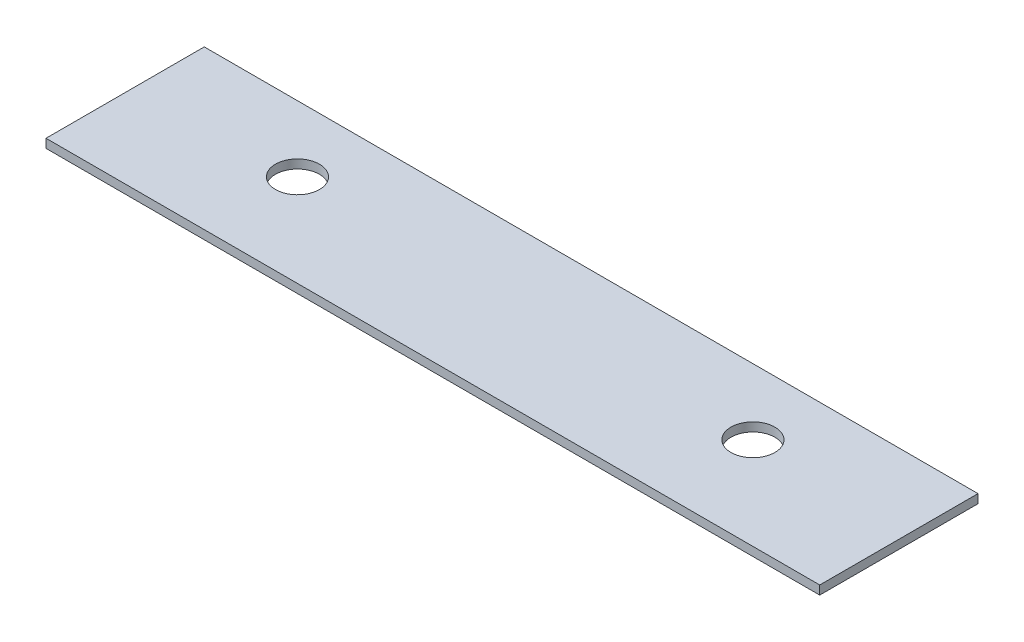
ISO-10303-21;
HEADER;
FILE_DESCRIPTION(('STEP AP214'),'2;1');
FILE_NAME('part.step','',(''),(''),'','','');
FILE_SCHEMA(('AUTOMOTIVE_DESIGN { 1 0 10303 214 1 1 1 1 }'));
ENDSEC;
DATA;
#1=APPLICATION_CONTEXT('core data for automotive mechanical design processes');
#2=APPLICATION_PROTOCOL_DEFINITION('international standard','automotive_design',2000,#1);
#3=PRODUCT_CONTEXT('',#1,'mechanical');
#4=PRODUCT('Part','Part','',(#3));
#5=PRODUCT_RELATED_PRODUCT_CATEGORY('part','',(#4));
#6=PRODUCT_DEFINITION_FORMATION('','',#4);
#7=PRODUCT_DEFINITION_CONTEXT('part definition',#1,'design');
#8=PRODUCT_DEFINITION('design','',#6,#7);
#9=PRODUCT_DEFINITION_SHAPE('','',#8);
#10=(LENGTH_UNIT() NAMED_UNIT(*) SI_UNIT(.MILLI.,.METRE.));
#11=(NAMED_UNIT(*) PLANE_ANGLE_UNIT() SI_UNIT($,.RADIAN.));
#12=(NAMED_UNIT(*) SI_UNIT($,.STERADIAN.) SOLID_ANGLE_UNIT());
#13=UNCERTAINTY_MEASURE_WITH_UNIT(LENGTH_MEASURE(1.E-05),#10,'distance_accuracy_value','');
#14=(GEOMETRIC_REPRESENTATION_CONTEXT(3) GLOBAL_UNCERTAINTY_ASSIGNED_CONTEXT((#13)) GLOBAL_UNIT_ASSIGNED_CONTEXT((#10,
#11,#12)) REPRESENTATION_CONTEXT('',''));
#15=CARTESIAN_POINT('',(0.,0.,0.));
#16=DIRECTION('',(0.,0.,1.));
#17=DIRECTION('',(1.,0.,0.));
#18=AXIS2_PLACEMENT_3D('',#15,#16,#17);
#19=CARTESIAN_POINT('',(0.0164218420878547,1.,1.69999250897351));
#20=DIRECTION('',(1.,0.,0.));
#21=DIRECTION('',(0.,0.,-1.));
#22=AXIS2_PLACEMENT_3D('',#19,#20,#21);
#23=PLANE('',#22);
#24=DIRECTION('',(0.,0.,1.));
#25=VECTOR('',#24,1.);
#26=CARTESIAN_POINT('',(0.0164218420878547,0.,1.69999250897351));
#27=LINE('',#26,#25);
#28=CARTESIAN_POINT('',(0.0164218420878547,0.,-16.3000074910265));
#29=VERTEX_POINT('',#28);
#30=CARTESIAN_POINT('',(0.0164218420878547,0.,1.69999250897351));
#31=VERTEX_POINT('',#30);
#32=EDGE_CURVE('E105',#29,#31,#27,.T.);
#33=ORIENTED_EDGE('',*,*,#32,.T.);
#34=DIRECTION('',(0.,-1.,0.));
#35=VECTOR('',#34,1.);
#36=CARTESIAN_POINT('',(0.0164218420878547,1.,1.69999250897351));
#37=LINE('',#36,#35);
#38=CARTESIAN_POINT('',(0.0164218420878547,1.,1.69999250897351));
#39=VERTEX_POINT('',#38);
#40=EDGE_CURVE('E11',#39,#31,#37,.T.);
#41=ORIENTED_EDGE('',*,*,#40,.F.);
#42=DIRECTION('',(0.,0.,1.));
#43=VECTOR('',#42,1.);
#44=CARTESIAN_POINT('',(0.0164218420878547,1.,1.69999250897351));
#45=LINE('',#44,#43);
#46=CARTESIAN_POINT('',(0.0164218420878547,1.,-16.3000074910265));
#47=VERTEX_POINT('',#46);
#48=EDGE_CURVE('E92',#47,#39,#45,.T.);
#49=ORIENTED_EDGE('',*,*,#48,.F.);
#50=DIRECTION('',(0.,-1.,0.));
#51=VECTOR('',#50,1.);
#52=CARTESIAN_POINT('',(0.0164218420878547,1.,-16.3000074910265));
#53=LINE('',#52,#51);
#54=EDGE_CURVE('E101',#47,#29,#53,.T.);
#55=ORIENTED_EDGE('',*,*,#54,.T.);
#56=EDGE_LOOP('',(#33,#41,#49,#55));
#57=FACE_BOUND('',#56,.T.);
#58=ADVANCED_FACE('F39',(#57),#23,.F.);
#59=CARTESIAN_POINT('',(0.0164218420878547,1.,1.69999250897351));
#60=DIRECTION('',(0.,0.,-1.));
#61=DIRECTION('',(-1.,0.,0.));
#62=AXIS2_PLACEMENT_3D('',#59,#60,#61);
#63=PLANE('',#62);
#64=DIRECTION('',(1.,0.,0.));
#65=VECTOR('',#64,1.);
#66=CARTESIAN_POINT('',(0.0164218420878547,0.,1.69999250897351));
#67=LINE('',#66,#65);
#68=CARTESIAN_POINT('',(88.0164218420879,0.,1.69999250897351));
#69=VERTEX_POINT('',#68);
#70=EDGE_CURVE('E96',#31,#69,#67,.T.);
#71=ORIENTED_EDGE('',*,*,#70,.T.);
#72=DIRECTION('',(0.,-1.,0.));
#73=VECTOR('',#72,1.);
#74=CARTESIAN_POINT('',(88.0164218420879,1.,1.69999250897351));
#75=LINE('',#74,#73);
#76=CARTESIAN_POINT('',(88.0164218420879,1.,1.69999250897351));
#77=VERTEX_POINT('',#76);
#78=EDGE_CURVE('E48',#77,#69,#75,.T.);
#79=ORIENTED_EDGE('',*,*,#78,.F.);
#80=DIRECTION('',(1.,0.,0.));
#81=VECTOR('',#80,1.);
#82=CARTESIAN_POINT('',(0.0164218420878547,1.,1.69999250897351));
#83=LINE('',#82,#81);
#84=EDGE_CURVE('E87',#39,#77,#83,.T.);
#85=ORIENTED_EDGE('',*,*,#84,.F.);
#86=ORIENTED_EDGE('',*,*,#40,.T.);
#87=EDGE_LOOP('',(#71,#79,#85,#86));
#88=FACE_BOUND('',#87,.T.);
#89=ADVANCED_FACE('F95',(#88),#63,.F.);
#90=CARTESIAN_POINT('',(88.0164218420879,1.,1.69999250897351));
#91=DIRECTION('',(-1.,0.,0.));
#92=DIRECTION('',(0.,0.,1.));
#93=AXIS2_PLACEMENT_3D('',#90,#91,#92);
#94=PLANE('',#93);
#95=DIRECTION('',(0.,0.,-1.));
#96=VECTOR('',#95,1.);
#97=CARTESIAN_POINT('',(88.0164218420879,0.,1.69999250897351));
#98=LINE('',#97,#96);
#99=CARTESIAN_POINT('',(88.0164218420878,0.,-16.3000074910265));
#100=VERTEX_POINT('',#99);
#101=EDGE_CURVE('E74',#69,#100,#98,.T.);
#102=ORIENTED_EDGE('',*,*,#101,.T.);
#103=DIRECTION('',(0.,-1.,0.));
#104=VECTOR('',#103,1.);
#105=CARTESIAN_POINT('',(88.0164218420878,1.,-16.3000074910265));
#106=LINE('',#105,#104);
#107=CARTESIAN_POINT('',(88.0164218420878,1.,-16.3000074910265));
#108=VERTEX_POINT('',#107);
#109=EDGE_CURVE('E97',#108,#100,#106,.T.);
#110=ORIENTED_EDGE('',*,*,#109,.F.);
#111=DIRECTION('',(0.,0.,-1.));
#112=VECTOR('',#111,1.);
#113=CARTESIAN_POINT('',(88.0164218420879,1.,1.69999250897351));
#114=LINE('',#113,#112);
#115=EDGE_CURVE('E90',#77,#108,#114,.T.);
#116=ORIENTED_EDGE('',*,*,#115,.F.);
#117=ORIENTED_EDGE('',*,*,#78,.T.);
#118=EDGE_LOOP('',(#102,#110,#116,#117));
#119=FACE_BOUND('',#118,.T.);
#120=ADVANCED_FACE('F99',(#119),#94,.F.);
#121=CARTESIAN_POINT('',(0.0164218420878547,1.,-16.3000074910265));
#122=DIRECTION('',(0.,0.,1.));
#123=DIRECTION('',(1.,0.,0.));
#124=AXIS2_PLACEMENT_3D('',#121,#122,#123);
#125=PLANE('',#124);
#126=DIRECTION('',(-1.,0.,0.));
#127=VECTOR('',#126,1.);
#128=CARTESIAN_POINT('',(0.0164218420878547,0.,-16.3000074910265));
#129=LINE('',#128,#127);
#130=EDGE_CURVE('E80',#100,#29,#129,.T.);
#131=ORIENTED_EDGE('',*,*,#130,.T.);
#132=ORIENTED_EDGE('',*,*,#54,.F.);
#133=DIRECTION('',(-1.,0.,0.));
#134=VECTOR('',#133,1.);
#135=CARTESIAN_POINT('',(0.0164218420878547,1.,-16.3000074910265));
#136=LINE('',#135,#134);
#137=EDGE_CURVE('E57',#108,#47,#136,.T.);
#138=ORIENTED_EDGE('',*,*,#137,.F.);
#139=ORIENTED_EDGE('',*,*,#109,.T.);
#140=EDGE_LOOP('',(#131,#132,#138,#139));
#141=FACE_BOUND('',#140,.T.);
#142=ADVANCED_FACE('F131',(#141),#125,.F.);
#143=CARTESIAN_POINT('',(0.,1.,0.));
#144=DIRECTION('',(0.,-1.,0.));
#145=DIRECTION('',(0.,0.,-1.));
#146=AXIS2_PLACEMENT_3D('',#143,#144,#145);
#147=PLANE('',#146);
#148=CARTESIAN_POINT('',(69.9164218420879,1.,-8.80000749102649));
#149=DIRECTION('',(0.,1.,0.));
#150=DIRECTION('',(0.,0.,1.));
#151=AXIS2_PLACEMENT_3D('',#148,#149,#150);
#152=CIRCLE('',#151,2.5);
#153=CARTESIAN_POINT('',(69.9164218420879,1.,-6.30000749102649));
#154=VERTEX_POINT('',#153);
#155=EDGE_CURVE('E114',#154,#154,#152,.T.);
#156=ORIENTED_EDGE('',*,*,#155,.F.);
#157=EDGE_LOOP('',(#156));
#158=FACE_BOUND('',#157,.T.);
#159=CARTESIAN_POINT('',(18.1164218420879,1.,-8.80000749102649));
#160=DIRECTION('',(0.,1.,0.));
#161=DIRECTION('',(0.,0.,1.));
#162=AXIS2_PLACEMENT_3D('',#159,#160,#161);
#163=CIRCLE('',#162,2.5);
#164=CARTESIAN_POINT('',(18.1164218420879,1.,-6.30000749102649));
#165=VERTEX_POINT('',#164);
#166=EDGE_CURVE('E119',#165,#165,#163,.T.);
#167=ORIENTED_EDGE('',*,*,#166,.F.);
#168=EDGE_LOOP('',(#167));
#169=FACE_BOUND('',#168,.T.);
#170=ORIENTED_EDGE('',*,*,#48,.T.);
#171=ORIENTED_EDGE('',*,*,#84,.T.);
#172=ORIENTED_EDGE('',*,*,#115,.T.);
#173=ORIENTED_EDGE('',*,*,#137,.T.);
#174=EDGE_LOOP('',(#170,#171,#172,#173));
#175=FACE_BOUND('',#174,.T.);
#176=ADVANCED_FACE('F88',(#158,#169,#175),#147,.F.);
#177=CARTESIAN_POINT('',(0.,0.,0.));
#178=DIRECTION('',(0.,-1.,0.));
#179=DIRECTION('',(0.,0.,-1.));
#180=AXIS2_PLACEMENT_3D('',#177,#178,#179);
#181=PLANE('',#180);
#182=CARTESIAN_POINT('',(69.9164218420879,0.,-8.80000749102649));
#183=DIRECTION('',(0.,-1.,0.));
#184=DIRECTION('',(0.,0.,-1.));
#185=AXIS2_PLACEMENT_3D('',#182,#183,#184);
#186=CIRCLE('',#185,2.5);
#187=CARTESIAN_POINT('',(69.9164218420879,0.,-11.3000074910265));
#188=VERTEX_POINT('',#187);
#189=EDGE_CURVE('E42',#188,#188,#186,.T.);
#190=ORIENTED_EDGE('',*,*,#189,.F.);
#191=EDGE_LOOP('',(#190));
#192=FACE_BOUND('',#191,.T.);
#193=CARTESIAN_POINT('',(18.1164218420879,0.,-8.80000749102649));
#194=DIRECTION('',(0.,-1.,0.));
#195=DIRECTION('',(0.,0.,-1.));
#196=AXIS2_PLACEMENT_3D('',#193,#194,#195);
#197=CIRCLE('',#196,2.5);
#198=CARTESIAN_POINT('',(18.1164218420879,0.,-11.3000074910265));
#199=VERTEX_POINT('',#198);
#200=EDGE_CURVE('E112',#199,#199,#197,.T.);
#201=ORIENTED_EDGE('',*,*,#200,.F.);
#202=EDGE_LOOP('',(#201));
#203=FACE_BOUND('',#202,.T.);
#204=ORIENTED_EDGE('',*,*,#32,.F.);
#205=ORIENTED_EDGE('',*,*,#130,.F.);
#206=ORIENTED_EDGE('',*,*,#101,.F.);
#207=ORIENTED_EDGE('',*,*,#70,.F.);
#208=EDGE_LOOP('',(#204,#205,#206,#207));
#209=FACE_BOUND('',#208,.T.);
#210=ADVANCED_FACE('F130',(#192,#203,#209),#181,.T.);
#211=CARTESIAN_POINT('',(18.1164218420879,-9.,-8.80000749102649));
#212=DIRECTION('',(0.,1.,0.));
#213=DIRECTION('',(0.,0.,1.));
#214=AXIS2_PLACEMENT_3D('',#211,#212,#213);
#215=CYLINDRICAL_SURFACE('',#214,2.5);
#216=ORIENTED_EDGE('',*,*,#200,.T.);
#217=EDGE_LOOP('',(#216));
#218=FACE_BOUND('',#217,.T.);
#219=ORIENTED_EDGE('',*,*,#166,.T.);
#220=EDGE_LOOP('',(#219));
#221=FACE_BOUND('',#220,.T.);
#222=ADVANCED_FACE('F127',(#218,#221),#215,.F.);
#223=CARTESIAN_POINT('',(69.9164218420879,-9.,-8.80000749102649));
#224=DIRECTION('',(0.,1.,0.));
#225=DIRECTION('',(0.,0.,1.));
#226=AXIS2_PLACEMENT_3D('',#223,#224,#225);
#227=CYLINDRICAL_SURFACE('',#226,2.5);
#228=ORIENTED_EDGE('',*,*,#189,.T.);
#229=EDGE_LOOP('',(#228));
#230=FACE_BOUND('',#229,.T.);
#231=ORIENTED_EDGE('',*,*,#155,.T.);
#232=EDGE_LOOP('',(#231));
#233=FACE_BOUND('',#232,.T.);
#234=ADVANCED_FACE('F180',(#230,#233),#227,.F.);
#235=CLOSED_SHELL('',(#58,#89,#120,#142,#176,#210,#222,#234));
#236=MANIFOLD_SOLID_BREP('B2',#235);
#237=ADVANCED_BREP_SHAPE_REPRESENTATION('',(#18,#236),#14);
#238=SHAPE_DEFINITION_REPRESENTATION(#9,#237);
ENDSEC;
END-ISO-10303-21;
